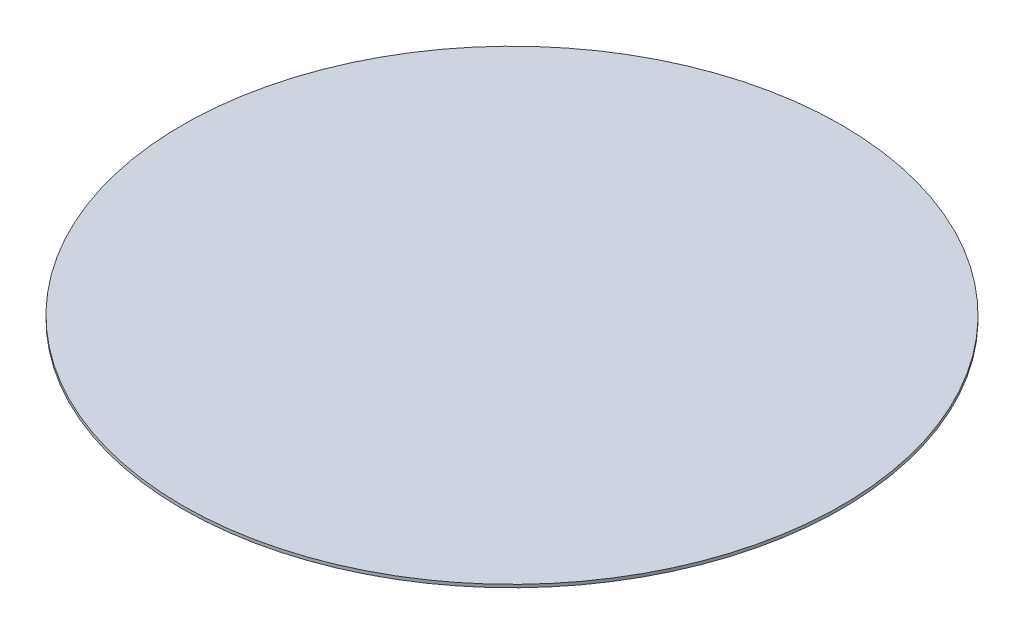
ISO-10303-21;
HEADER;
FILE_DESCRIPTION(('STEP AP214'),'2;1');
FILE_NAME('part.step','',(''),(''),'','','');
FILE_SCHEMA(('AUTOMOTIVE_DESIGN { 1 0 10303 214 1 1 1 1 }'));
ENDSEC;
DATA;
#1=APPLICATION_CONTEXT('core data for automotive mechanical design processes');
#2=APPLICATION_PROTOCOL_DEFINITION('international standard','automotive_design',2000,#1);
#3=PRODUCT_CONTEXT('',#1,'mechanical');
#4=PRODUCT('Part','Part','',(#3));
#5=PRODUCT_RELATED_PRODUCT_CATEGORY('part','',(#4));
#6=PRODUCT_DEFINITION_FORMATION('','',#4);
#7=PRODUCT_DEFINITION_CONTEXT('part definition',#1,'design');
#8=PRODUCT_DEFINITION('design','',#6,#7);
#9=PRODUCT_DEFINITION_SHAPE('','',#8);
#10=(LENGTH_UNIT() NAMED_UNIT(*) SI_UNIT(.MILLI.,.METRE.));
#11=(NAMED_UNIT(*) PLANE_ANGLE_UNIT() SI_UNIT($,.RADIAN.));
#12=(NAMED_UNIT(*) SI_UNIT($,.STERADIAN.) SOLID_ANGLE_UNIT());
#13=UNCERTAINTY_MEASURE_WITH_UNIT(LENGTH_MEASURE(1.E-05),#10,'distance_accuracy_value','');
#14=(GEOMETRIC_REPRESENTATION_CONTEXT(3) GLOBAL_UNCERTAINTY_ASSIGNED_CONTEXT((#13)) GLOBAL_UNIT_ASSIGNED_CONTEXT((#10,
#11,#12)) REPRESENTATION_CONTEXT('',''));
#15=CARTESIAN_POINT('',(0.,0.,0.));
#16=DIRECTION('',(0.,0.,1.));
#17=DIRECTION('',(1.,0.,0.));
#18=AXIS2_PLACEMENT_3D('',#15,#16,#17);
#19=CARTESIAN_POINT('',(0.,0.25,0.));
#20=DIRECTION('',(0.,-1.,0.));
#21=DIRECTION('',(0.,0.,-1.));
#22=AXIS2_PLACEMENT_3D('',#19,#20,#21);
#23=CYLINDRICAL_SURFACE('',#22,27.5);
#24=CARTESIAN_POINT('',(0.,0.25,0.));
#25=DIRECTION('',(0.,1.,0.));
#26=DIRECTION('',(0.,0.,1.));
#27=AXIS2_PLACEMENT_3D('',#24,#25,#26);
#28=CIRCLE('',#27,27.5);
#29=CARTESIAN_POINT('',(0.,0.25,27.5));
#30=VERTEX_POINT('',#29);
#31=EDGE_CURVE('E10',#30,#30,#28,.T.);
#32=ORIENTED_EDGE('',*,*,#31,.F.);
#33=EDGE_LOOP('',(#32));
#34=FACE_BOUND('',#33,.T.);
#35=CARTESIAN_POINT('',(0.,0.,0.));
#36=DIRECTION('',(0.,1.,0.));
#37=DIRECTION('',(0.,0.,1.));
#38=AXIS2_PLACEMENT_3D('',#35,#36,#37);
#39=CIRCLE('',#38,27.5);
#40=CARTESIAN_POINT('',(0.,0.,27.5));
#41=VERTEX_POINT('',#40);
#42=EDGE_CURVE('E34',#41,#41,#39,.T.);
#43=ORIENTED_EDGE('',*,*,#42,.T.);
#44=EDGE_LOOP('',(#43));
#45=FACE_BOUND('',#44,.T.);
#46=ADVANCED_FACE('F31',(#34,#45),#23,.T.);
#47=CARTESIAN_POINT('',(0.,0.25,0.));
#48=DIRECTION('',(0.,1.,0.));
#49=DIRECTION('',(0.,0.,1.));
#50=AXIS2_PLACEMENT_3D('',#47,#48,#49);
#51=PLANE('',#50);
#52=ORIENTED_EDGE('',*,*,#31,.T.);
#53=EDGE_LOOP('',(#52));
#54=FACE_BOUND('',#53,.T.);
#55=ADVANCED_FACE('F46',(#54),#51,.T.);
#56=CARTESIAN_POINT('',(0.,0.,0.));
#57=DIRECTION('',(0.,1.,0.));
#58=DIRECTION('',(0.,0.,1.));
#59=AXIS2_PLACEMENT_3D('',#56,#57,#58);
#60=PLANE('',#59);
#61=ORIENTED_EDGE('',*,*,#42,.F.);
#62=EDGE_LOOP('',(#61));
#63=FACE_BOUND('',#62,.T.);
#64=ADVANCED_FACE('F44',(#63),#60,.F.);
#65=CLOSED_SHELL('',(#46,#55,#64));
#66=MANIFOLD_SOLID_BREP('B2',#65);
#67=ADVANCED_BREP_SHAPE_REPRESENTATION('',(#18,#66),#14);
#68=SHAPE_DEFINITION_REPRESENTATION(#9,#67);
ENDSEC;
END-ISO-10303-21;
